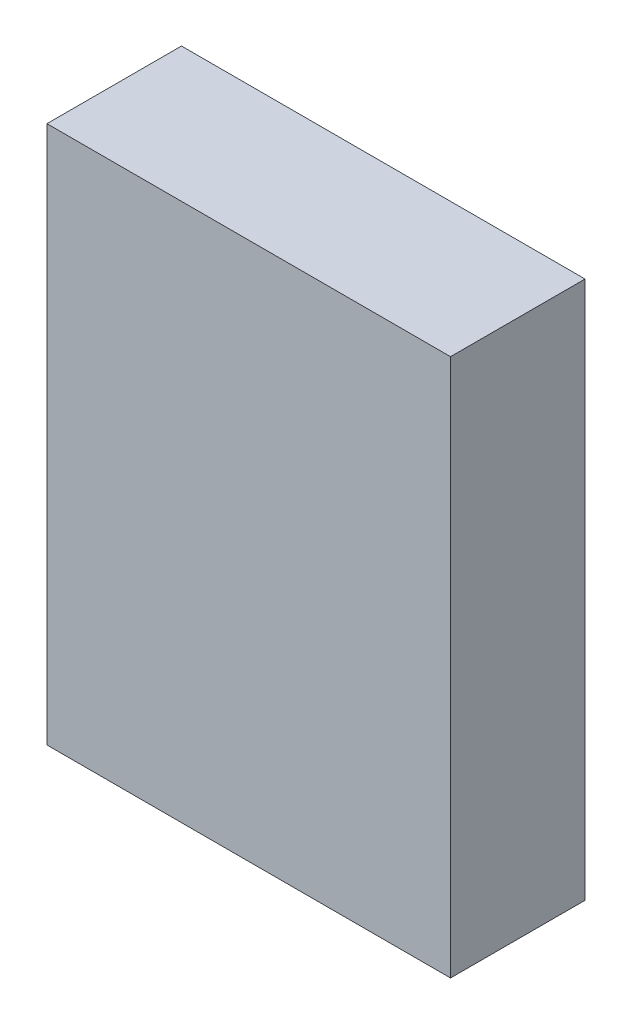
ISO-10303-21;
HEADER;
FILE_DESCRIPTION(('STEP AP214'),'2;1');
FILE_NAME('part.step','',(''),(''),'','','');
FILE_SCHEMA(('AUTOMOTIVE_DESIGN { 1 0 10303 214 1 1 1 1 }'));
ENDSEC;
DATA;
#1=APPLICATION_CONTEXT('core data for automotive mechanical design processes');
#2=APPLICATION_PROTOCOL_DEFINITION('international standard','automotive_design',2000,#1);
#3=PRODUCT_CONTEXT('',#1,'mechanical');
#4=PRODUCT('Part','Part','',(#3));
#5=PRODUCT_RELATED_PRODUCT_CATEGORY('part','',(#4));
#6=PRODUCT_DEFINITION_FORMATION('','',#4);
#7=PRODUCT_DEFINITION_CONTEXT('part definition',#1,'design');
#8=PRODUCT_DEFINITION('design','',#6,#7);
#9=PRODUCT_DEFINITION_SHAPE('','',#8);
#10=(LENGTH_UNIT() NAMED_UNIT(*) SI_UNIT(.MILLI.,.METRE.));
#11=(NAMED_UNIT(*) PLANE_ANGLE_UNIT() SI_UNIT($,.RADIAN.));
#12=(NAMED_UNIT(*) SI_UNIT($,.STERADIAN.) SOLID_ANGLE_UNIT());
#13=UNCERTAINTY_MEASURE_WITH_UNIT(LENGTH_MEASURE(1.E-05),#10,'distance_accuracy_value','');
#14=(GEOMETRIC_REPRESENTATION_CONTEXT(3) GLOBAL_UNCERTAINTY_ASSIGNED_CONTEXT((#13)) GLOBAL_UNIT_ASSIGNED_CONTEXT((#10,
#11,#12)) REPRESENTATION_CONTEXT('',''));
#15=CARTESIAN_POINT('',(0.,0.,0.));
#16=DIRECTION('',(0.,0.,1.));
#17=DIRECTION('',(1.,0.,0.));
#18=AXIS2_PLACEMENT_3D('',#15,#16,#17);
#19=CARTESIAN_POINT('',(-6.59420289855073,16.0507246376812,5.));
#20=DIRECTION('',(1.,0.,0.));
#21=DIRECTION('',(0.,1.,0.));
#22=AXIS2_PLACEMENT_3D('',#19,#20,#21);
#23=PLANE('',#22);
#24=DIRECTION('',(0.,-1.,0.));
#25=VECTOR('',#24,1.);
#26=CARTESIAN_POINT('',(-6.59420289855073,16.0507246376812,0.));
#27=LINE('',#26,#25);
#28=CARTESIAN_POINT('',(-6.59420289855073,16.0507246376812,0.));
#29=VERTEX_POINT('',#28);
#30=CARTESIAN_POINT('',(-6.59420289855073,-3.94927536231884,0.));
#31=VERTEX_POINT('',#30);
#32=EDGE_CURVE('E106',#29,#31,#27,.T.);
#33=ORIENTED_EDGE('',*,*,#32,.T.);
#34=DIRECTION('',(0.,0.,-1.));
#35=VECTOR('',#34,1.);
#36=CARTESIAN_POINT('',(-6.59420289855073,-3.94927536231884,5.));
#37=LINE('',#36,#35);
#38=CARTESIAN_POINT('',(-6.59420289855073,-3.94927536231884,5.));
#39=VERTEX_POINT('',#38);
#40=EDGE_CURVE('E11',#39,#31,#37,.T.);
#41=ORIENTED_EDGE('',*,*,#40,.F.);
#42=DIRECTION('',(0.,-1.,0.));
#43=VECTOR('',#42,1.);
#44=CARTESIAN_POINT('',(-6.59420289855073,16.0507246376812,5.));
#45=LINE('',#44,#43);
#46=CARTESIAN_POINT('',(-6.59420289855073,16.0507246376812,5.));
#47=VERTEX_POINT('',#46);
#48=EDGE_CURVE('E94',#47,#39,#45,.T.);
#49=ORIENTED_EDGE('',*,*,#48,.F.);
#50=DIRECTION('',(0.,0.,-1.));
#51=VECTOR('',#50,1.);
#52=CARTESIAN_POINT('',(-6.59420289855073,16.0507246376812,5.));
#53=LINE('',#52,#51);
#54=EDGE_CURVE('E102',#47,#29,#53,.T.);
#55=ORIENTED_EDGE('',*,*,#54,.T.);
#56=EDGE_LOOP('',(#33,#41,#49,#55));
#57=FACE_BOUND('',#56,.T.);
#58=ADVANCED_FACE('F43',(#57),#23,.F.);
#59=CARTESIAN_POINT('',(-6.59420289855073,-3.94927536231884,5.));
#60=DIRECTION('',(0.,1.,0.));
#61=DIRECTION('',(0.,0.,1.));
#62=AXIS2_PLACEMENT_3D('',#59,#60,#61);
#63=PLANE('',#62);
#64=DIRECTION('',(1.,0.,0.));
#65=VECTOR('',#64,1.);
#66=CARTESIAN_POINT('',(-6.59420289855073,-3.94927536231884,0.));
#67=LINE('',#66,#65);
#68=CARTESIAN_POINT('',(8.40579710144927,-3.94927536231884,0.));
#69=VERTEX_POINT('',#68);
#70=EDGE_CURVE('E98',#31,#69,#67,.T.);
#71=ORIENTED_EDGE('',*,*,#70,.T.);
#72=DIRECTION('',(0.,0.,-1.));
#73=VECTOR('',#72,1.);
#74=CARTESIAN_POINT('',(8.40579710144927,-3.94927536231884,5.));
#75=LINE('',#74,#73);
#76=CARTESIAN_POINT('',(8.40579710144927,-3.94927536231884,5.));
#77=VERTEX_POINT('',#76);
#78=EDGE_CURVE('E51',#77,#69,#75,.T.);
#79=ORIENTED_EDGE('',*,*,#78,.F.);
#80=DIRECTION('',(1.,0.,0.));
#81=VECTOR('',#80,1.);
#82=CARTESIAN_POINT('',(-6.59420289855073,-3.94927536231884,5.));
#83=LINE('',#82,#81);
#84=EDGE_CURVE('E89',#39,#77,#83,.T.);
#85=ORIENTED_EDGE('',*,*,#84,.F.);
#86=ORIENTED_EDGE('',*,*,#40,.T.);
#87=EDGE_LOOP('',(#71,#79,#85,#86));
#88=FACE_BOUND('',#87,.T.);
#89=ADVANCED_FACE('F97',(#88),#63,.F.);
#90=CARTESIAN_POINT('',(8.40579710144926,16.0507246376812,5.));
#91=DIRECTION('',(-1.,0.,0.));
#92=DIRECTION('',(0.,-1.,0.));
#93=AXIS2_PLACEMENT_3D('',#90,#91,#92);
#94=PLANE('',#93);
#95=DIRECTION('',(0.,1.,0.));
#96=VECTOR('',#95,1.);
#97=CARTESIAN_POINT('',(8.40579710144926,16.0507246376812,0.));
#98=LINE('',#97,#96);
#99=CARTESIAN_POINT('',(8.40579710144926,16.0507246376812,0.));
#100=VERTEX_POINT('',#99);
#101=EDGE_CURVE('E76',#69,#100,#98,.T.);
#102=ORIENTED_EDGE('',*,*,#101,.T.);
#103=DIRECTION('',(0.,0.,-1.));
#104=VECTOR('',#103,1.);
#105=CARTESIAN_POINT('',(8.40579710144926,16.0507246376812,5.));
#106=LINE('',#105,#104);
#107=CARTESIAN_POINT('',(8.40579710144926,16.0507246376812,5.));
#108=VERTEX_POINT('',#107);
#109=EDGE_CURVE('E99',#108,#100,#106,.T.);
#110=ORIENTED_EDGE('',*,*,#109,.F.);
#111=DIRECTION('',(0.,1.,0.));
#112=VECTOR('',#111,1.);
#113=CARTESIAN_POINT('',(8.40579710144926,16.0507246376812,5.));
#114=LINE('',#113,#112);
#115=EDGE_CURVE('E92',#77,#108,#114,.T.);
#116=ORIENTED_EDGE('',*,*,#115,.F.);
#117=ORIENTED_EDGE('',*,*,#78,.T.);
#118=EDGE_LOOP('',(#102,#110,#116,#117));
#119=FACE_BOUND('',#118,.T.);
#120=ADVANCED_FACE('F100',(#119),#94,.F.);
#121=CARTESIAN_POINT('',(-6.59420289855073,16.0507246376812,5.));
#122=DIRECTION('',(0.,-1.,0.));
#123=DIRECTION('',(0.,0.,-1.));
#124=AXIS2_PLACEMENT_3D('',#121,#122,#123);
#125=PLANE('',#124);
#126=DIRECTION('',(-1.,0.,0.));
#127=VECTOR('',#126,1.);
#128=CARTESIAN_POINT('',(-6.59420289855073,16.0507246376812,0.));
#129=LINE('',#128,#127);
#130=EDGE_CURVE('E82',#100,#29,#129,.T.);
#131=ORIENTED_EDGE('',*,*,#130,.T.);
#132=ORIENTED_EDGE('',*,*,#54,.F.);
#133=DIRECTION('',(-1.,0.,0.));
#134=VECTOR('',#133,1.);
#135=CARTESIAN_POINT('',(-6.59420289855073,16.0507246376812,5.));
#136=LINE('',#135,#134);
#137=EDGE_CURVE('E59',#108,#47,#136,.T.);
#138=ORIENTED_EDGE('',*,*,#137,.F.);
#139=ORIENTED_EDGE('',*,*,#109,.T.);
#140=EDGE_LOOP('',(#131,#132,#138,#139));
#141=FACE_BOUND('',#140,.T.);
#142=ADVANCED_FACE('F113',(#141),#125,.F.);
#143=CARTESIAN_POINT('',(0.,0.,5.));
#144=DIRECTION('',(0.,0.,1.));
#145=DIRECTION('',(1.,0.,0.));
#146=AXIS2_PLACEMENT_3D('',#143,#144,#145);
#147=PLANE('',#146);
#148=ORIENTED_EDGE('',*,*,#48,.T.);
#149=ORIENTED_EDGE('',*,*,#84,.T.);
#150=ORIENTED_EDGE('',*,*,#115,.T.);
#151=ORIENTED_EDGE('',*,*,#137,.T.);
#152=EDGE_LOOP('',(#148,#149,#150,#151));
#153=FACE_BOUND('',#152,.T.);
#154=ADVANCED_FACE('F90',(#153),#147,.T.);
#155=CARTESIAN_POINT('',(0.,0.,0.));
#156=DIRECTION('',(0.,0.,1.));
#157=DIRECTION('',(1.,0.,0.));
#158=AXIS2_PLACEMENT_3D('',#155,#156,#157);
#159=PLANE('',#158);
#160=ORIENTED_EDGE('',*,*,#32,.F.);
#161=ORIENTED_EDGE('',*,*,#130,.F.);
#162=ORIENTED_EDGE('',*,*,#101,.F.);
#163=ORIENTED_EDGE('',*,*,#70,.F.);
#164=EDGE_LOOP('',(#160,#161,#162,#163));
#165=FACE_BOUND('',#164,.T.);
#166=ADVANCED_FACE('F116',(#165),#159,.F.);
#167=CLOSED_SHELL('',(#58,#89,#120,#142,#154,#166));
#168=MANIFOLD_SOLID_BREP('B2',#167);
#169=ADVANCED_BREP_SHAPE_REPRESENTATION('',(#18,#168),#14);
#170=SHAPE_DEFINITION_REPRESENTATION(#9,#169);
ENDSEC;
END-ISO-10303-21;
